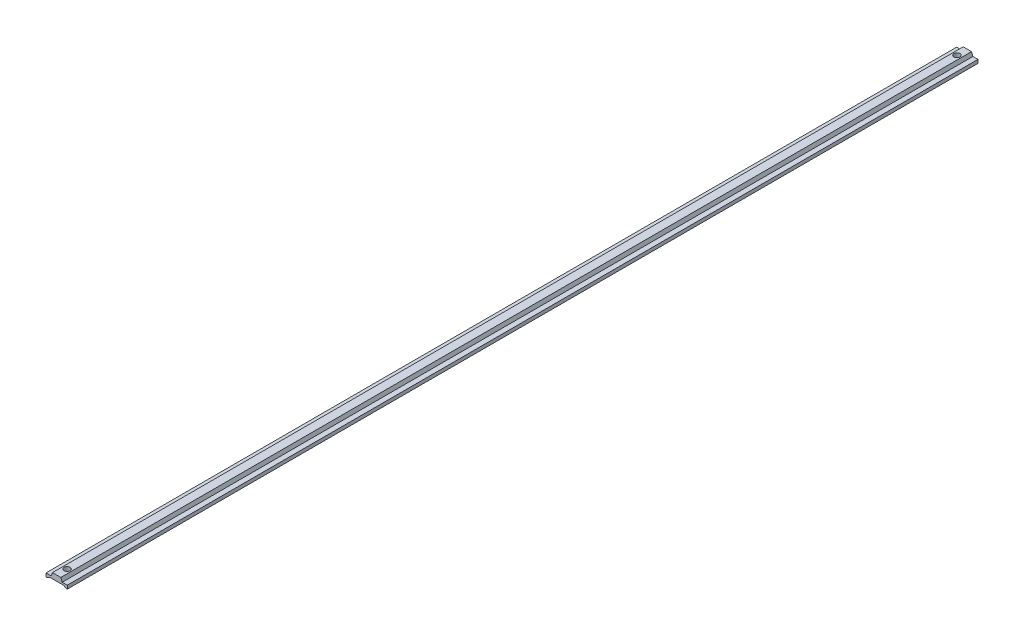
ISO-10303-21;
HEADER;
FILE_DESCRIPTION(('STEP AP214'),'2;1');
FILE_NAME('part.step','',(''),(''),'','','');
FILE_SCHEMA(('AUTOMOTIVE_DESIGN { 1 0 10303 214 1 1 1 1 }'));
ENDSEC;
DATA;
#1=APPLICATION_CONTEXT('core data for automotive mechanical design processes');
#2=APPLICATION_PROTOCOL_DEFINITION('international standard','automotive_design',2000,#1);
#3=PRODUCT_CONTEXT('',#1,'mechanical');
#4=PRODUCT('Part','Part','',(#3));
#5=PRODUCT_RELATED_PRODUCT_CATEGORY('part','',(#4));
#6=PRODUCT_DEFINITION_FORMATION('','',#4);
#7=PRODUCT_DEFINITION_CONTEXT('part definition',#1,'design');
#8=PRODUCT_DEFINITION('design','',#6,#7);
#9=PRODUCT_DEFINITION_SHAPE('','',#8);
#10=(LENGTH_UNIT() NAMED_UNIT(*) SI_UNIT(.MILLI.,.METRE.));
#11=(NAMED_UNIT(*) PLANE_ANGLE_UNIT() SI_UNIT($,.RADIAN.));
#12=(NAMED_UNIT(*) SI_UNIT($,.STERADIAN.) SOLID_ANGLE_UNIT());
#13=UNCERTAINTY_MEASURE_WITH_UNIT(LENGTH_MEASURE(1.E-05),#10,'distance_accuracy_value','');
#14=(GEOMETRIC_REPRESENTATION_CONTEXT(3) GLOBAL_UNCERTAINTY_ASSIGNED_CONTEXT((#13)) GLOBAL_UNIT_ASSIGNED_CONTEXT((#10,
#11,#12)) REPRESENTATION_CONTEXT('',''));
#15=CARTESIAN_POINT('',(0.,0.,0.));
#16=DIRECTION('',(0.,0.,1.));
#17=DIRECTION('',(1.,0.,0.));
#18=AXIS2_PLACEMENT_3D('',#15,#16,#17);
#19=CARTESIAN_POINT('',(2.58620689655172,1.03448275862069,655.));
#20=DIRECTION('',(0.928476690885259,0.371390676354104,0.));
#21=DIRECTION('',(-0.371390676354104,0.92847669088526,0.));
#22=AXIS2_PLACEMENT_3D('',#19,#20,#21);
#23=PLANE('',#22);
#24=DIRECTION('',(0.371390676354104,-0.928476690885259,0.));
#25=VECTOR('',#24,1.);
#26=CARTESIAN_POINT('',(2.58620689655172,1.03448275862069,0.));
#27=LINE('',#26,#25);
#28=CARTESIAN_POINT('',(3.,0.,0.));
#29=VERTEX_POINT('',#28);
#30=CARTESIAN_POINT('',(4.,-2.5,0.));
#31=VERTEX_POINT('',#30);
#32=EDGE_CURVE('E156',#29,#31,#27,.T.);
#33=ORIENTED_EDGE('',*,*,#32,.F.);
#34=DIRECTION('',(0.,0.,-1.));
#35=VECTOR('',#34,1.);
#36=CARTESIAN_POINT('',(3.,0.,655.));
#37=LINE('',#36,#35);
#38=CARTESIAN_POINT('',(3.,0.,655.));
#39=VERTEX_POINT('',#38);
#40=EDGE_CURVE('E11',#39,#29,#37,.T.);
#41=ORIENTED_EDGE('',*,*,#40,.F.);
#42=DIRECTION('',(0.371390676354104,-0.928476690885259,0.));
#43=VECTOR('',#42,1.);
#44=CARTESIAN_POINT('',(2.58620689655172,1.03448275862069,655.));
#45=LINE('',#44,#43);
#46=CARTESIAN_POINT('',(4.,-2.5,655.));
#47=VERTEX_POINT('',#46);
#48=EDGE_CURVE('E183',#39,#47,#45,.T.);
#49=ORIENTED_EDGE('',*,*,#48,.T.);
#50=DIRECTION('',(0.,0.,-1.));
#51=VECTOR('',#50,1.);
#52=CARTESIAN_POINT('',(4.,-2.5,655.));
#53=LINE('',#52,#51);
#54=EDGE_CURVE('E55',#47,#31,#53,.T.);
#55=ORIENTED_EDGE('',*,*,#54,.T.);
#56=EDGE_LOOP('',(#33,#41,#49,#55));
#57=FACE_BOUND('',#56,.T.);
#58=ADVANCED_FACE('F39',(#57),#23,.T.);
#59=CARTESIAN_POINT('',(0.,0.,655.));
#60=DIRECTION('',(0.,-1.,0.));
#61=DIRECTION('',(0.,0.,-1.));
#62=AXIS2_PLACEMENT_3D('',#59,#60,#61);
#63=PLANE('',#62);
#64=CARTESIAN_POINT('',(0.,0.,7.5));
#65=DIRECTION('',(0.,1.,0.));
#66=DIRECTION('',(0.,0.,1.));
#67=AXIS2_PLACEMENT_3D('',#64,#65,#66);
#68=CIRCLE('',#67,2.15);
#69=CARTESIAN_POINT('',(0.,0.,9.65));
#70=VERTEX_POINT('',#69);
#71=EDGE_CURVE('E354',#70,#70,#68,.T.);
#72=ORIENTED_EDGE('',*,*,#71,.F.);
#73=EDGE_LOOP('',(#72));
#74=FACE_BOUND('',#73,.T.);
#75=CARTESIAN_POINT('',(0.,0.,647.5));
#76=DIRECTION('',(0.,1.,0.));
#77=DIRECTION('',(0.,0.,-1.));
#78=AXIS2_PLACEMENT_3D('',#75,#76,#77);
#79=CIRCLE('',#78,2.15000000000003);
#80=CARTESIAN_POINT('',(0.,0.,645.35));
#81=VERTEX_POINT('',#80);
#82=EDGE_CURVE('E359',#81,#81,#79,.T.);
#83=ORIENTED_EDGE('',*,*,#82,.F.);
#84=EDGE_LOOP('',(#83));
#85=FACE_BOUND('',#84,.T.);
#86=DIRECTION('',(-1.,0.,0.));
#87=VECTOR('',#86,1.);
#88=CARTESIAN_POINT('',(0.,0.,0.));
#89=LINE('',#88,#87);
#90=CARTESIAN_POINT('',(-3.,0.,0.));
#91=VERTEX_POINT('',#90);
#92=EDGE_CURVE('E158',#29,#91,#89,.T.);
#93=ORIENTED_EDGE('',*,*,#92,.T.);
#94=DIRECTION('',(0.,0.,-1.));
#95=VECTOR('',#94,1.);
#96=CARTESIAN_POINT('',(-3.,0.,655.));
#97=LINE('',#96,#95);
#98=CARTESIAN_POINT('',(-3.,0.,655.));
#99=VERTEX_POINT('',#98);
#100=EDGE_CURVE('E47',#99,#91,#97,.T.);
#101=ORIENTED_EDGE('',*,*,#100,.F.);
#102=DIRECTION('',(-1.,0.,0.));
#103=VECTOR('',#102,1.);
#104=CARTESIAN_POINT('',(0.,0.,655.));
#105=LINE('',#104,#103);
#106=EDGE_CURVE('E365',#39,#99,#105,.T.);
#107=ORIENTED_EDGE('',*,*,#106,.F.);
#108=ORIENTED_EDGE('',*,*,#40,.T.);
#109=EDGE_LOOP('',(#93,#101,#107,#108));
#110=FACE_BOUND('',#109,.T.);
#111=ADVANCED_FACE('F254',(#74,#85,#110),#63,.F.);
#112=CARTESIAN_POINT('',(-2.58620689655172,1.03448275862069,655.));
#113=DIRECTION('',(0.928476690885259,-0.371390676354104,0.));
#114=DIRECTION('',(0.371390676354104,0.92847669088526,0.));
#115=AXIS2_PLACEMENT_3D('',#112,#113,#114);
#116=PLANE('',#115);
#117=DIRECTION('',(-0.371390676354104,-0.928476690885259,0.));
#118=VECTOR('',#117,1.);
#119=CARTESIAN_POINT('',(-2.58620689655172,1.03448275862069,0.));
#120=LINE('',#119,#118);
#121=CARTESIAN_POINT('',(-4.,-2.5,0.));
#122=VERTEX_POINT('',#121);
#123=EDGE_CURVE('E161',#91,#122,#120,.T.);
#124=ORIENTED_EDGE('',*,*,#123,.T.);
#125=DIRECTION('',(0.,0.,-1.));
#126=VECTOR('',#125,1.);
#127=CARTESIAN_POINT('',(-4.,-2.5,655.));
#128=LINE('',#127,#126);
#129=CARTESIAN_POINT('',(-4.,-2.5,655.));
#130=VERTEX_POINT('',#129);
#131=EDGE_CURVE('E201',#130,#122,#128,.T.);
#132=ORIENTED_EDGE('',*,*,#131,.F.);
#133=DIRECTION('',(-0.371390676354104,-0.928476690885259,0.));
#134=VECTOR('',#133,1.);
#135=CARTESIAN_POINT('',(-2.58620689655172,1.03448275862069,655.));
#136=LINE('',#135,#134);
#137=EDGE_CURVE('E210',#99,#130,#136,.T.);
#138=ORIENTED_EDGE('',*,*,#137,.F.);
#139=ORIENTED_EDGE('',*,*,#100,.T.);
#140=EDGE_LOOP('',(#124,#132,#138,#139));
#141=FACE_BOUND('',#140,.T.);
#142=ADVANCED_FACE('F208',(#141),#116,.F.);
#143=CARTESIAN_POINT('',(0.,-2.5,655.));
#144=DIRECTION('',(0.,-1.,0.));
#145=DIRECTION('',(0.,0.,-1.));
#146=AXIS2_PLACEMENT_3D('',#143,#144,#145);
#147=PLANE('',#146);
#148=DIRECTION('',(-1.,0.,0.));
#149=VECTOR('',#148,1.);
#150=CARTESIAN_POINT('',(0.,-2.5,0.));
#151=LINE('',#150,#149);
#152=CARTESIAN_POINT('',(-7.65,-2.5,0.));
#153=VERTEX_POINT('',#152);
#154=EDGE_CURVE('E163',#122,#153,#151,.T.);
#155=ORIENTED_EDGE('',*,*,#154,.T.);
#156=DIRECTION('',(0.,0.,-1.));
#157=VECTOR('',#156,1.);
#158=CARTESIAN_POINT('',(-7.65,-2.5,655.));
#159=LINE('',#158,#157);
#160=CARTESIAN_POINT('',(-7.65,-2.5,655.));
#161=VERTEX_POINT('',#160);
#162=EDGE_CURVE('E198',#161,#153,#159,.T.);
#163=ORIENTED_EDGE('',*,*,#162,.F.);
#164=DIRECTION('',(-1.,0.,0.));
#165=VECTOR('',#164,1.);
#166=CARTESIAN_POINT('',(0.,-2.5,655.));
#167=LINE('',#166,#165);
#168=EDGE_CURVE('E229',#130,#161,#167,.T.);
#169=ORIENTED_EDGE('',*,*,#168,.F.);
#170=ORIENTED_EDGE('',*,*,#131,.T.);
#171=EDGE_LOOP('',(#155,#163,#169,#170));
#172=FACE_BOUND('',#171,.T.);
#173=ADVANCED_FACE('F220',(#172),#147,.F.);
#174=CARTESIAN_POINT('',(-7.65,0.,655.));
#175=DIRECTION('',(1.,0.,0.));
#176=DIRECTION('',(0.,1.,0.));
#177=AXIS2_PLACEMENT_3D('',#174,#175,#176);
#178=PLANE('',#177);
#179=DIRECTION('',(0.,-1.,0.));
#180=VECTOR('',#179,1.);
#181=CARTESIAN_POINT('',(-7.65,0.,0.));
#182=LINE('',#181,#180);
#183=CARTESIAN_POINT('',(-7.65,-5.,0.));
#184=VERTEX_POINT('',#183);
#185=EDGE_CURVE('E165',#153,#184,#182,.T.);
#186=ORIENTED_EDGE('',*,*,#185,.T.);
#187=DIRECTION('',(0.,0.,-1.));
#188=VECTOR('',#187,1.);
#189=CARTESIAN_POINT('',(-7.65,-5.,655.));
#190=LINE('',#189,#188);
#191=CARTESIAN_POINT('',(-7.65,-5.,655.));
#192=VERTEX_POINT('',#191);
#193=EDGE_CURVE('E195',#192,#184,#190,.T.);
#194=ORIENTED_EDGE('',*,*,#193,.F.);
#195=DIRECTION('',(0.,-1.,0.));
#196=VECTOR('',#195,1.);
#197=CARTESIAN_POINT('',(-7.65,0.,655.));
#198=LINE('',#197,#196);
#199=EDGE_CURVE('E226',#161,#192,#198,.T.);
#200=ORIENTED_EDGE('',*,*,#199,.F.);
#201=ORIENTED_EDGE('',*,*,#162,.T.);
#202=EDGE_LOOP('',(#186,#194,#200,#201));
#203=FACE_BOUND('',#202,.T.);
#204=ADVANCED_FACE('F224',(#203),#178,.F.);
#205=CARTESIAN_POINT('',(0.,-5.,655.));
#206=DIRECTION('',(0.,1.,0.));
#207=DIRECTION('',(0.,0.,1.));
#208=AXIS2_PLACEMENT_3D('',#205,#206,#207);
#209=PLANE('',#208);
#210=DIRECTION('',(1.,0.,0.));
#211=VECTOR('',#210,1.);
#212=CARTESIAN_POINT('',(0.,-5.,0.));
#213=LINE('',#212,#211);
#214=CARTESIAN_POINT('',(-6.65,-5.,0.));
#215=VERTEX_POINT('',#214);
#216=EDGE_CURVE('E167',#184,#215,#213,.T.);
#217=ORIENTED_EDGE('',*,*,#216,.T.);
#218=DIRECTION('',(0.,0.,-1.));
#219=VECTOR('',#218,1.);
#220=CARTESIAN_POINT('',(-6.65,-5.,655.));
#221=LINE('',#220,#219);
#222=CARTESIAN_POINT('',(-6.65,-5.,655.));
#223=VERTEX_POINT('',#222);
#224=EDGE_CURVE('E192',#223,#215,#221,.T.);
#225=ORIENTED_EDGE('',*,*,#224,.F.);
#226=DIRECTION('',(1.,0.,0.));
#227=VECTOR('',#226,1.);
#228=CARTESIAN_POINT('',(0.,-5.,655.));
#229=LINE('',#228,#227);
#230=EDGE_CURVE('E228',#192,#223,#229,.T.);
#231=ORIENTED_EDGE('',*,*,#230,.F.);
#232=ORIENTED_EDGE('',*,*,#193,.T.);
#233=EDGE_LOOP('',(#217,#225,#231,#232));
#234=FACE_BOUND('',#233,.T.);
#235=ADVANCED_FACE('F270',(#234),#209,.F.);
#236=CARTESIAN_POINT('',(0.199867374005307,-0.290716180371357,655.));
#237=DIRECTION('',(-0.566528822887065,0.824041924199368,0.));
#238=DIRECTION('',(-0.824041924199368,-0.566528822887065,0.));
#239=AXIS2_PLACEMENT_3D('',#236,#237,#238);
#240=PLANE('',#239);
#241=DIRECTION('',(0.824041924199368,0.566528822887065,0.));
#242=VECTOR('',#241,1.);
#243=CARTESIAN_POINT('',(0.199867374005307,-0.290716180371357,0.));
#244=LINE('',#243,#242);
#245=CARTESIAN_POINT('',(-5.05,-3.9,0.));
#246=VERTEX_POINT('',#245);
#247=EDGE_CURVE('E169',#215,#246,#244,.T.);
#248=ORIENTED_EDGE('',*,*,#247,.T.);
#249=DIRECTION('',(0.,0.,-1.));
#250=VECTOR('',#249,1.);
#251=CARTESIAN_POINT('',(-5.05,-3.9,655.));
#252=LINE('',#251,#250);
#253=CARTESIAN_POINT('',(-5.05,-3.9,655.));
#254=VERTEX_POINT('',#253);
#255=EDGE_CURVE('E189',#254,#246,#252,.T.);
#256=ORIENTED_EDGE('',*,*,#255,.F.);
#257=DIRECTION('',(0.824041924199368,0.566528822887065,0.));
#258=VECTOR('',#257,1.);
#259=CARTESIAN_POINT('',(0.199867374005307,-0.290716180371357,655.));
#260=LINE('',#259,#258);
#261=EDGE_CURVE('E231',#223,#254,#260,.T.);
#262=ORIENTED_EDGE('',*,*,#261,.F.);
#263=ORIENTED_EDGE('',*,*,#224,.T.);
#264=EDGE_LOOP('',(#248,#256,#262,#263));
#265=FACE_BOUND('',#264,.T.);
#266=ADVANCED_FACE('F273',(#265),#240,.F.);
#267=CARTESIAN_POINT('',(0.,-3.9,655.));
#268=DIRECTION('',(0.,1.,0.));
#269=DIRECTION('',(0.,0.,1.));
#270=AXIS2_PLACEMENT_3D('',#267,#268,#269);
#271=PLANE('',#270);
#272=CARTESIAN_POINT('',(0.,-3.9,7.5));
#273=DIRECTION('',(0.,1.,0.));
#274=DIRECTION('',(0.,0.,1.));
#275=AXIS2_PLACEMENT_3D('',#272,#273,#274);
#276=CIRCLE('',#275,2.15);
#277=CARTESIAN_POINT('',(0.,-3.9,9.65));
#278=VERTEX_POINT('',#277);
#279=EDGE_CURVE('E159',#278,#278,#276,.F.);
#280=ORIENTED_EDGE('',*,*,#279,.F.);
#281=EDGE_LOOP('',(#280));
#282=FACE_BOUND('',#281,.T.);
#283=CARTESIAN_POINT('',(0.,-3.9,647.5));
#284=DIRECTION('',(0.,1.,0.));
#285=DIRECTION('',(0.,0.,1.));
#286=AXIS2_PLACEMENT_3D('',#283,#284,#285);
#287=CIRCLE('',#286,2.15000000000003);
#288=CARTESIAN_POINT('',(0.,-3.9,649.65));
#289=VERTEX_POINT('',#288);
#290=EDGE_CURVE('E355',#289,#289,#287,.F.);
#291=ORIENTED_EDGE('',*,*,#290,.F.);
#292=EDGE_LOOP('',(#291));
#293=FACE_BOUND('',#292,.T.);
#294=DIRECTION('',(1.,0.,0.));
#295=VECTOR('',#294,1.);
#296=CARTESIAN_POINT('',(0.,-3.9,0.));
#297=LINE('',#296,#295);
#298=CARTESIAN_POINT('',(5.05,-3.9,0.));
#299=VERTEX_POINT('',#298);
#300=EDGE_CURVE('E171',#246,#299,#297,.T.);
#301=ORIENTED_EDGE('',*,*,#300,.T.);
#302=DIRECTION('',(0.,0.,-1.));
#303=VECTOR('',#302,1.);
#304=CARTESIAN_POINT('',(5.05,-3.9,655.));
#305=LINE('',#304,#303);
#306=CARTESIAN_POINT('',(5.05,-3.9,655.));
#307=VERTEX_POINT('',#306);
#308=EDGE_CURVE('E187',#307,#299,#305,.T.);
#309=ORIENTED_EDGE('',*,*,#308,.F.);
#310=DIRECTION('',(1.,0.,0.));
#311=VECTOR('',#310,1.);
#312=CARTESIAN_POINT('',(0.,-3.9,655.));
#313=LINE('',#312,#311);
#314=EDGE_CURVE('E237',#254,#307,#313,.T.);
#315=ORIENTED_EDGE('',*,*,#314,.F.);
#316=ORIENTED_EDGE('',*,*,#255,.T.);
#317=EDGE_LOOP('',(#301,#309,#315,#316));
#318=FACE_BOUND('',#317,.T.);
#319=ADVANCED_FACE('F277',(#282,#293,#318),#271,.F.);
#320=CARTESIAN_POINT('',(-0.199867374005307,-0.290716180371357,655.));
#321=DIRECTION('',(-0.566528822887065,-0.824041924199368,0.));
#322=DIRECTION('',(0.824041924199368,-0.566528822887065,0.));
#323=AXIS2_PLACEMENT_3D('',#320,#321,#322);
#324=PLANE('',#323);
#325=DIRECTION('',(-0.824041924199368,0.566528822887065,0.));
#326=VECTOR('',#325,1.);
#327=CARTESIAN_POINT('',(-0.199867374005307,-0.290716180371357,0.));
#328=LINE('',#327,#326);
#329=CARTESIAN_POINT('',(6.65,-5.,0.));
#330=VERTEX_POINT('',#329);
#331=EDGE_CURVE('E174',#330,#299,#328,.T.);
#332=ORIENTED_EDGE('',*,*,#331,.F.);
#333=DIRECTION('',(0.,0.,-1.));
#334=VECTOR('',#333,1.);
#335=CARTESIAN_POINT('',(6.65,-5.,655.));
#336=LINE('',#335,#334);
#337=CARTESIAN_POINT('',(6.65,-5.,655.));
#338=VERTEX_POINT('',#337);
#339=EDGE_CURVE('E138',#338,#330,#336,.T.);
#340=ORIENTED_EDGE('',*,*,#339,.F.);
#341=DIRECTION('',(-0.824041924199368,0.566528822887065,0.));
#342=VECTOR('',#341,1.);
#343=CARTESIAN_POINT('',(-0.199867374005307,-0.290716180371357,655.));
#344=LINE('',#343,#342);
#345=EDGE_CURVE('E148',#338,#307,#344,.T.);
#346=ORIENTED_EDGE('',*,*,#345,.T.);
#347=ORIENTED_EDGE('',*,*,#308,.T.);
#348=EDGE_LOOP('',(#332,#340,#346,#347));
#349=FACE_BOUND('',#348,.T.);
#350=ADVANCED_FACE('F240',(#349),#324,.T.);
#351=CARTESIAN_POINT('',(0.,-5.,655.));
#352=DIRECTION('',(0.,-1.,0.));
#353=DIRECTION('',(0.,0.,-1.));
#354=AXIS2_PLACEMENT_3D('',#351,#352,#353);
#355=PLANE('',#354);
#356=DIRECTION('',(-1.,0.,0.));
#357=VECTOR('',#356,1.);
#358=CARTESIAN_POINT('',(0.,-5.,0.));
#359=LINE('',#358,#357);
#360=CARTESIAN_POINT('',(7.65,-5.,0.));
#361=VERTEX_POINT('',#360);
#362=EDGE_CURVE('E134',#361,#330,#359,.T.);
#363=ORIENTED_EDGE('',*,*,#362,.F.);
#364=DIRECTION('',(0.,0.,-1.));
#365=VECTOR('',#364,1.);
#366=CARTESIAN_POINT('',(7.65,-5.,655.));
#367=LINE('',#366,#365);
#368=CARTESIAN_POINT('',(7.65,-5.,655.));
#369=VERTEX_POINT('',#368);
#370=EDGE_CURVE('E129',#369,#361,#367,.T.);
#371=ORIENTED_EDGE('',*,*,#370,.F.);
#372=DIRECTION('',(-1.,0.,0.));
#373=VECTOR('',#372,1.);
#374=CARTESIAN_POINT('',(0.,-5.,655.));
#375=LINE('',#374,#373);
#376=EDGE_CURVE('E132',#369,#338,#375,.T.);
#377=ORIENTED_EDGE('',*,*,#376,.T.);
#378=ORIENTED_EDGE('',*,*,#339,.T.);
#379=EDGE_LOOP('',(#363,#371,#377,#378));
#380=FACE_BOUND('',#379,.T.);
#381=ADVANCED_FACE('F131',(#380),#355,.T.);
#382=CARTESIAN_POINT('',(7.65,0.,655.));
#383=DIRECTION('',(1.,0.,0.));
#384=DIRECTION('',(0.,1.,0.));
#385=AXIS2_PLACEMENT_3D('',#382,#383,#384);
#386=PLANE('',#385);
#387=DIRECTION('',(0.,-1.,0.));
#388=VECTOR('',#387,1.);
#389=CARTESIAN_POINT('',(7.65,0.,0.));
#390=LINE('',#389,#388);
#391=CARTESIAN_POINT('',(7.65,-2.5,0.));
#392=VERTEX_POINT('',#391);
#393=EDGE_CURVE('E178',#392,#361,#390,.T.);
#394=ORIENTED_EDGE('',*,*,#393,.F.);
#395=DIRECTION('',(0.,0.,-1.));
#396=VECTOR('',#395,1.);
#397=CARTESIAN_POINT('',(7.65,-2.5,655.));
#398=LINE('',#397,#396);
#399=CARTESIAN_POINT('',(7.65,-2.5,655.));
#400=VERTEX_POINT('',#399);
#401=EDGE_CURVE('E92',#400,#392,#398,.T.);
#402=ORIENTED_EDGE('',*,*,#401,.F.);
#403=DIRECTION('',(0.,-1.,0.));
#404=VECTOR('',#403,1.);
#405=CARTESIAN_POINT('',(7.65,0.,655.));
#406=LINE('',#405,#404);
#407=EDGE_CURVE('E146',#400,#369,#406,.T.);
#408=ORIENTED_EDGE('',*,*,#407,.T.);
#409=ORIENTED_EDGE('',*,*,#370,.T.);
#410=EDGE_LOOP('',(#394,#402,#408,#409));
#411=FACE_BOUND('',#410,.T.);
#412=ADVANCED_FACE('F150',(#411),#386,.T.);
#413=CARTESIAN_POINT('',(0.,-2.5,655.));
#414=DIRECTION('',(0.,1.,0.));
#415=DIRECTION('',(0.,0.,1.));
#416=AXIS2_PLACEMENT_3D('',#413,#414,#415);
#417=PLANE('',#416);
#418=DIRECTION('',(1.,0.,0.));
#419=VECTOR('',#418,1.);
#420=CARTESIAN_POINT('',(0.,-2.5,0.));
#421=LINE('',#420,#419);
#422=EDGE_CURVE('E180',#31,#392,#421,.T.);
#423=ORIENTED_EDGE('',*,*,#422,.F.);
#424=ORIENTED_EDGE('',*,*,#54,.F.);
#425=DIRECTION('',(1.,0.,0.));
#426=VECTOR('',#425,1.);
#427=CARTESIAN_POINT('',(0.,-2.5,655.));
#428=LINE('',#427,#426);
#429=EDGE_CURVE('E151',#47,#400,#428,.T.);
#430=ORIENTED_EDGE('',*,*,#429,.T.);
#431=ORIENTED_EDGE('',*,*,#401,.T.);
#432=EDGE_LOOP('',(#423,#424,#430,#431));
#433=FACE_BOUND('',#432,.T.);
#434=ADVANCED_FACE('F243',(#433),#417,.T.);
#435=CARTESIAN_POINT('',(0.,0.,655.));
#436=DIRECTION('',(0.,0.,1.));
#437=DIRECTION('',(1.,0.,0.));
#438=AXIS2_PLACEMENT_3D('',#435,#436,#437);
#439=PLANE('',#438);
#440=ORIENTED_EDGE('',*,*,#48,.F.);
#441=ORIENTED_EDGE('',*,*,#106,.T.);
#442=ORIENTED_EDGE('',*,*,#137,.T.);
#443=ORIENTED_EDGE('',*,*,#168,.T.);
#444=ORIENTED_EDGE('',*,*,#199,.T.);
#445=ORIENTED_EDGE('',*,*,#230,.T.);
#446=ORIENTED_EDGE('',*,*,#261,.T.);
#447=ORIENTED_EDGE('',*,*,#314,.T.);
#448=ORIENTED_EDGE('',*,*,#345,.F.);
#449=ORIENTED_EDGE('',*,*,#376,.F.);
#450=ORIENTED_EDGE('',*,*,#407,.F.);
#451=ORIENTED_EDGE('',*,*,#429,.F.);
#452=EDGE_LOOP('',(#440,#441,#442,#443,#444,#445,#446,#447,#448,#449,#450,#451));
#453=FACE_BOUND('',#452,.T.);
#454=ADVANCED_FACE('F144',(#453),#439,.T.);
#455=CARTESIAN_POINT('',(0.,0.,0.));
#456=DIRECTION('',(0.,0.,1.));
#457=DIRECTION('',(1.,0.,0.));
#458=AXIS2_PLACEMENT_3D('',#455,#456,#457);
#459=PLANE('',#458);
#460=ORIENTED_EDGE('',*,*,#32,.T.);
#461=ORIENTED_EDGE('',*,*,#422,.T.);
#462=ORIENTED_EDGE('',*,*,#393,.T.);
#463=ORIENTED_EDGE('',*,*,#362,.T.);
#464=ORIENTED_EDGE('',*,*,#331,.T.);
#465=ORIENTED_EDGE('',*,*,#300,.F.);
#466=ORIENTED_EDGE('',*,*,#247,.F.);
#467=ORIENTED_EDGE('',*,*,#216,.F.);
#468=ORIENTED_EDGE('',*,*,#185,.F.);
#469=ORIENTED_EDGE('',*,*,#154,.F.);
#470=ORIENTED_EDGE('',*,*,#123,.F.);
#471=ORIENTED_EDGE('',*,*,#92,.F.);
#472=EDGE_LOOP('',(#460,#461,#462,#463,#464,#465,#466,#467,#468,#469,#470,#471));
#473=FACE_BOUND('',#472,.T.);
#474=ADVANCED_FACE('F215',(#473),#459,.F.);
#475=CARTESIAN_POINT('',(0.,-9.98111831820433,647.5));
#476=DIRECTION('',(0.,1.,0.));
#477=DIRECTION('',(0.,0.,1.));
#478=AXIS2_PLACEMENT_3D('',#475,#476,#477);
#479=CYLINDRICAL_SURFACE('',#478,2.15000000000003);
#480=ORIENTED_EDGE('',*,*,#290,.T.);
#481=EDGE_LOOP('',(#480));
#482=FACE_BOUND('',#481,.T.);
#483=ORIENTED_EDGE('',*,*,#82,.T.);
#484=EDGE_LOOP('',(#483));
#485=FACE_BOUND('',#484,.T.);
#486=ADVANCED_FACE('F313',(#482,#485),#479,.F.);
#487=CARTESIAN_POINT('',(0.,-9.98111831820433,7.5));
#488=DIRECTION('',(0.,1.,0.));
#489=DIRECTION('',(0.,0.,1.));
#490=AXIS2_PLACEMENT_3D('',#487,#488,#489);
#491=CYLINDRICAL_SURFACE('',#490,2.15);
#492=ORIENTED_EDGE('',*,*,#279,.T.);
#493=EDGE_LOOP('',(#492));
#494=FACE_BOUND('',#493,.T.);
#495=ORIENTED_EDGE('',*,*,#71,.T.);
#496=EDGE_LOOP('',(#495));
#497=FACE_BOUND('',#496,.T.);
#498=ADVANCED_FACE('F336',(#494,#497),#491,.F.);
#499=CLOSED_SHELL('',(#58,#111,#142,#173,#204,#235,#266,#319,#350,#381,#412,#434,#454,#474,#486,#498));
#500=MANIFOLD_SOLID_BREP('B2',#499);
#501=ADVANCED_BREP_SHAPE_REPRESENTATION('',(#18,#500),#14);
#502=SHAPE_DEFINITION_REPRESENTATION(#9,#501);
ENDSEC;
END-ISO-10303-21;
